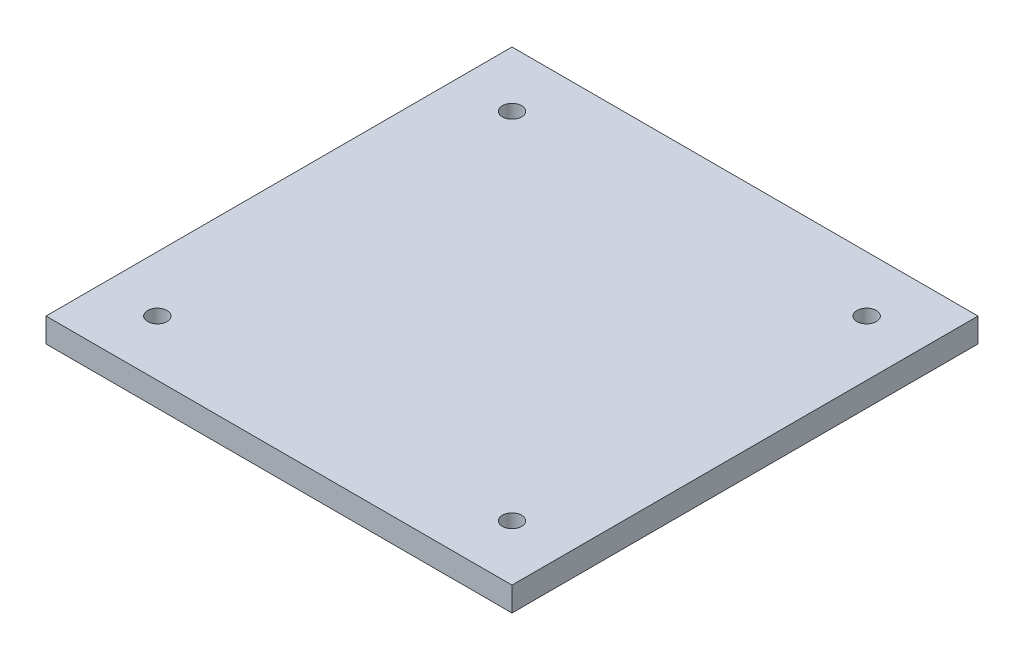
ISO-10303-21;
HEADER;
FILE_DESCRIPTION(('STEP AP214'),'2;1');
FILE_NAME('part.step','',(''),(''),'','','');
FILE_SCHEMA(('AUTOMOTIVE_DESIGN { 1 0 10303 214 1 1 1 1 }'));
ENDSEC;
DATA;
#1=APPLICATION_CONTEXT('core data for automotive mechanical design processes');
#2=APPLICATION_PROTOCOL_DEFINITION('international standard','automotive_design',2000,#1);
#3=PRODUCT_CONTEXT('',#1,'mechanical');
#4=PRODUCT('Part','Part','',(#3));
#5=PRODUCT_RELATED_PRODUCT_CATEGORY('part','',(#4));
#6=PRODUCT_DEFINITION_FORMATION('','',#4);
#7=PRODUCT_DEFINITION_CONTEXT('part definition',#1,'design');
#8=PRODUCT_DEFINITION('design','',#6,#7);
#9=PRODUCT_DEFINITION_SHAPE('','',#8);
#10=(LENGTH_UNIT() NAMED_UNIT(*) SI_UNIT(.MILLI.,.METRE.));
#11=(NAMED_UNIT(*) PLANE_ANGLE_UNIT() SI_UNIT($,.RADIAN.));
#12=(NAMED_UNIT(*) SI_UNIT($,.STERADIAN.) SOLID_ANGLE_UNIT());
#13=UNCERTAINTY_MEASURE_WITH_UNIT(LENGTH_MEASURE(1.E-05),#10,'distance_accuracy_value','');
#14=(GEOMETRIC_REPRESENTATION_CONTEXT(3) GLOBAL_UNCERTAINTY_ASSIGNED_CONTEXT((#13)) GLOBAL_UNIT_ASSIGNED_CONTEXT((#10,
#11,#12)) REPRESENTATION_CONTEXT('',''));
#15=CARTESIAN_POINT('',(0.,0.,0.));
#16=DIRECTION('',(0.,0.,1.));
#17=DIRECTION('',(1.,0.,0.));
#18=AXIS2_PLACEMENT_3D('',#15,#16,#17);
#19=CARTESIAN_POINT('',(-19.5844754492533,2.,-13.0472222222222));
#20=DIRECTION('',(1.,0.,0.));
#21=DIRECTION('',(0.,0.,-1.));
#22=AXIS2_PLACEMENT_3D('',#19,#20,#21);
#23=PLANE('',#22);
#24=DIRECTION('',(0.,0.,1.));
#25=VECTOR('',#24,1.);
#26=CARTESIAN_POINT('',(-19.5844754492533,0.,-13.0472222222222));
#27=LINE('',#26,#25);
#28=CARTESIAN_POINT('',(-19.5844754492533,0.,-13.0472222222222));
#29=VERTEX_POINT('',#28);
#30=CARTESIAN_POINT('',(-19.5844754492533,0.,25.4527777777778));
#31=VERTEX_POINT('',#30);
#32=EDGE_CURVE('E98',#29,#31,#27,.T.);
#33=ORIENTED_EDGE('',*,*,#32,.T.);
#34=DIRECTION('',(0.,-1.,0.));
#35=VECTOR('',#34,1.);
#36=CARTESIAN_POINT('',(-19.5844754492533,2.,25.4527777777778));
#37=LINE('',#36,#35);
#38=CARTESIAN_POINT('',(-19.5844754492533,2.,25.4527777777778));
#39=VERTEX_POINT('',#38);
#40=EDGE_CURVE('E11',#39,#31,#37,.T.);
#41=ORIENTED_EDGE('',*,*,#40,.F.);
#42=DIRECTION('',(0.,0.,1.));
#43=VECTOR('',#42,1.);
#44=CARTESIAN_POINT('',(-19.5844754492533,2.,-13.0472222222222));
#45=LINE('',#44,#43);
#46=CARTESIAN_POINT('',(-19.5844754492533,2.,-13.0472222222222));
#47=VERTEX_POINT('',#46);
#48=EDGE_CURVE('E86',#47,#39,#45,.T.);
#49=ORIENTED_EDGE('',*,*,#48,.F.);
#50=DIRECTION('',(0.,-1.,0.));
#51=VECTOR('',#50,1.);
#52=CARTESIAN_POINT('',(-19.5844754492533,2.,-13.0472222222222));
#53=LINE('',#52,#51);
#54=EDGE_CURVE('E94',#47,#29,#53,.T.);
#55=ORIENTED_EDGE('',*,*,#54,.T.);
#56=EDGE_LOOP('',(#33,#41,#49,#55));
#57=FACE_BOUND('',#56,.T.);
#58=ADVANCED_FACE('F35',(#57),#23,.F.);
#59=CARTESIAN_POINT('',(-19.5844754492533,2.,25.4527777777778));
#60=DIRECTION('',(0.,0.,-1.));
#61=DIRECTION('',(-1.,0.,0.));
#62=AXIS2_PLACEMENT_3D('',#59,#60,#61);
#63=PLANE('',#62);
#64=DIRECTION('',(1.,0.,0.));
#65=VECTOR('',#64,1.);
#66=CARTESIAN_POINT('',(-19.5844754492533,0.,25.4527777777778));
#67=LINE('',#66,#65);
#68=CARTESIAN_POINT('',(18.9155245507467,0.,25.4527777777778));
#69=VERTEX_POINT('',#68);
#70=EDGE_CURVE('E90',#31,#69,#67,.T.);
#71=ORIENTED_EDGE('',*,*,#70,.T.);
#72=DIRECTION('',(0.,-1.,0.));
#73=VECTOR('',#72,1.);
#74=CARTESIAN_POINT('',(18.9155245507467,2.,25.4527777777778));
#75=LINE('',#74,#73);
#76=CARTESIAN_POINT('',(18.9155245507467,2.,25.4527777777778));
#77=VERTEX_POINT('',#76);
#78=EDGE_CURVE('E43',#77,#69,#75,.T.);
#79=ORIENTED_EDGE('',*,*,#78,.F.);
#80=DIRECTION('',(1.,0.,0.));
#81=VECTOR('',#80,1.);
#82=CARTESIAN_POINT('',(-19.5844754492533,2.,25.4527777777778));
#83=LINE('',#82,#81);
#84=EDGE_CURVE('E81',#39,#77,#83,.T.);
#85=ORIENTED_EDGE('',*,*,#84,.F.);
#86=ORIENTED_EDGE('',*,*,#40,.T.);
#87=EDGE_LOOP('',(#71,#79,#85,#86));
#88=FACE_BOUND('',#87,.T.);
#89=ADVANCED_FACE('F89',(#88),#63,.F.);
#90=CARTESIAN_POINT('',(18.9155245507467,2.,-13.0472222222222));
#91=DIRECTION('',(-1.,0.,0.));
#92=DIRECTION('',(0.,0.,1.));
#93=AXIS2_PLACEMENT_3D('',#90,#91,#92);
#94=PLANE('',#93);
#95=DIRECTION('',(0.,0.,-1.));
#96=VECTOR('',#95,1.);
#97=CARTESIAN_POINT('',(18.9155245507467,0.,-13.0472222222222));
#98=LINE('',#97,#96);
#99=CARTESIAN_POINT('',(18.9155245507467,0.,-13.0472222222222));
#100=VERTEX_POINT('',#99);
#101=EDGE_CURVE('E68',#69,#100,#98,.T.);
#102=ORIENTED_EDGE('',*,*,#101,.T.);
#103=DIRECTION('',(0.,-1.,0.));
#104=VECTOR('',#103,1.);
#105=CARTESIAN_POINT('',(18.9155245507467,2.,-13.0472222222222));
#106=LINE('',#105,#104);
#107=CARTESIAN_POINT('',(18.9155245507467,2.,-13.0472222222222));
#108=VERTEX_POINT('',#107);
#109=EDGE_CURVE('E91',#108,#100,#106,.T.);
#110=ORIENTED_EDGE('',*,*,#109,.F.);
#111=DIRECTION('',(0.,0.,-1.));
#112=VECTOR('',#111,1.);
#113=CARTESIAN_POINT('',(18.9155245507467,2.,-13.0472222222222));
#114=LINE('',#113,#112);
#115=EDGE_CURVE('E84',#77,#108,#114,.T.);
#116=ORIENTED_EDGE('',*,*,#115,.F.);
#117=ORIENTED_EDGE('',*,*,#78,.T.);
#118=EDGE_LOOP('',(#102,#110,#116,#117));
#119=FACE_BOUND('',#118,.T.);
#120=ADVANCED_FACE('F92',(#119),#94,.F.);
#121=CARTESIAN_POINT('',(-19.5844754492533,2.,-13.0472222222222));
#122=DIRECTION('',(0.,0.,1.));
#123=DIRECTION('',(1.,0.,0.));
#124=AXIS2_PLACEMENT_3D('',#121,#122,#123);
#125=PLANE('',#124);
#126=DIRECTION('',(-1.,0.,0.));
#127=VECTOR('',#126,1.);
#128=CARTESIAN_POINT('',(-19.5844754492533,0.,-13.0472222222222));
#129=LINE('',#128,#127);
#130=EDGE_CURVE('E74',#100,#29,#129,.T.);
#131=ORIENTED_EDGE('',*,*,#130,.T.);
#132=ORIENTED_EDGE('',*,*,#54,.F.);
#133=DIRECTION('',(-1.,0.,0.));
#134=VECTOR('',#133,1.);
#135=CARTESIAN_POINT('',(-19.5844754492533,2.,-13.0472222222222));
#136=LINE('',#135,#134);
#137=EDGE_CURVE('E51',#108,#47,#136,.T.);
#138=ORIENTED_EDGE('',*,*,#137,.F.);
#139=ORIENTED_EDGE('',*,*,#109,.T.);
#140=EDGE_LOOP('',(#131,#132,#138,#139));
#141=FACE_BOUND('',#140,.T.);
#142=ADVANCED_FACE('F106',(#141),#125,.F.);
#143=CARTESIAN_POINT('',(0.,2.,0.));
#144=DIRECTION('',(0.,1.,0.));
#145=DIRECTION('',(0.,0.,1.));
#146=AXIS2_PLACEMENT_3D('',#143,#144,#145);
#147=PLANE('',#146);
#148=CARTESIAN_POINT('',(-14.9844754492533,2.,-8.44722222222222));
#149=DIRECTION('',(0.,1.,0.));
#150=DIRECTION('',(0.,0.,1.));
#151=AXIS2_PLACEMENT_3D('',#148,#149,#150);
#152=CIRCLE('',#151,0.799999999999988);
#153=CARTESIAN_POINT('',(-14.9844754492533,2.,-7.64722222222223));
#154=VERTEX_POINT('',#153);
#155=EDGE_CURVE('E132',#154,#154,#152,.T.);
#156=ORIENTED_EDGE('',*,*,#155,.F.);
#157=EDGE_LOOP('',(#156));
#158=FACE_BOUND('',#157,.T.);
#159=CARTESIAN_POINT('',(14.3155245507467,2.,20.8527777777778));
#160=DIRECTION('',(0.,1.,0.));
#161=DIRECTION('',(0.,0.,1.));
#162=AXIS2_PLACEMENT_3D('',#159,#160,#161);
#163=CIRCLE('',#162,0.799999999999988);
#164=CARTESIAN_POINT('',(14.3155245507467,2.,21.6527777777778));
#165=VERTEX_POINT('',#164);
#166=EDGE_CURVE('E126',#165,#165,#163,.T.);
#167=ORIENTED_EDGE('',*,*,#166,.F.);
#168=EDGE_LOOP('',(#167));
#169=FACE_BOUND('',#168,.T.);
#170=CARTESIAN_POINT('',(14.3155245507467,2.,-8.44722222222222));
#171=DIRECTION('',(0.,1.,0.));
#172=DIRECTION('',(0.,0.,1.));
#173=AXIS2_PLACEMENT_3D('',#170,#171,#172);
#174=CIRCLE('',#173,0.799999999999988);
#175=CARTESIAN_POINT('',(14.3155245507467,2.,-7.64722222222223));
#176=VERTEX_POINT('',#175);
#177=EDGE_CURVE('E120',#176,#176,#174,.T.);
#178=ORIENTED_EDGE('',*,*,#177,.F.);
#179=EDGE_LOOP('',(#178));
#180=FACE_BOUND('',#179,.T.);
#181=CARTESIAN_POINT('',(-14.9844754492533,2.,20.8527777777778));
#182=DIRECTION('',(0.,1.,0.));
#183=DIRECTION('',(0.,0.,1.));
#184=AXIS2_PLACEMENT_3D('',#181,#182,#183);
#185=CIRCLE('',#184,0.799999999999988);
#186=CARTESIAN_POINT('',(-14.9844754492533,2.,21.6527777777778));
#187=VERTEX_POINT('',#186);
#188=EDGE_CURVE('E114',#187,#187,#185,.T.);
#189=ORIENTED_EDGE('',*,*,#188,.F.);
#190=EDGE_LOOP('',(#189));
#191=FACE_BOUND('',#190,.T.);
#192=ORIENTED_EDGE('',*,*,#48,.T.);
#193=ORIENTED_EDGE('',*,*,#84,.T.);
#194=ORIENTED_EDGE('',*,*,#115,.T.);
#195=ORIENTED_EDGE('',*,*,#137,.T.);
#196=EDGE_LOOP('',(#192,#193,#194,#195));
#197=FACE_BOUND('',#196,.T.);
#198=ADVANCED_FACE('F82',(#158,#169,#180,#191,#197),#147,.T.);
#199=CARTESIAN_POINT('',(0.,0.,0.));
#200=DIRECTION('',(0.,1.,0.));
#201=DIRECTION('',(0.,0.,1.));
#202=AXIS2_PLACEMENT_3D('',#199,#200,#201);
#203=PLANE('',#202);
#204=CARTESIAN_POINT('',(-14.9844754492533,0.,-8.44722222222222));
#205=DIRECTION('',(0.,1.,0.));
#206=DIRECTION('',(0.,0.,1.));
#207=AXIS2_PLACEMENT_3D('',#204,#205,#206);
#208=CIRCLE('',#207,0.799999999999993);
#209=CARTESIAN_POINT('',(-14.9844754492533,0.,-7.64722222222223));
#210=VERTEX_POINT('',#209);
#211=EDGE_CURVE('E129',#210,#210,#208,.T.);
#212=ORIENTED_EDGE('',*,*,#211,.T.);
#213=EDGE_LOOP('',(#212));
#214=FACE_BOUND('',#213,.T.);
#215=CARTESIAN_POINT('',(14.3155245507467,0.,20.8527777777778));
#216=DIRECTION('',(0.,1.,0.));
#217=DIRECTION('',(0.,0.,1.));
#218=AXIS2_PLACEMENT_3D('',#215,#216,#217);
#219=CIRCLE('',#218,0.799999999999993);
#220=CARTESIAN_POINT('',(14.3155245507467,0.,21.6527777777778));
#221=VERTEX_POINT('',#220);
#222=EDGE_CURVE('E123',#221,#221,#219,.T.);
#223=ORIENTED_EDGE('',*,*,#222,.T.);
#224=EDGE_LOOP('',(#223));
#225=FACE_BOUND('',#224,.T.);
#226=CARTESIAN_POINT('',(14.3155245507467,0.,-8.44722222222222));
#227=DIRECTION('',(0.,1.,0.));
#228=DIRECTION('',(0.,0.,1.));
#229=AXIS2_PLACEMENT_3D('',#226,#227,#228);
#230=CIRCLE('',#229,0.799999999999993);
#231=CARTESIAN_POINT('',(14.3155245507467,0.,-7.64722222222223));
#232=VERTEX_POINT('',#231);
#233=EDGE_CURVE('E117',#232,#232,#230,.T.);
#234=ORIENTED_EDGE('',*,*,#233,.T.);
#235=EDGE_LOOP('',(#234));
#236=FACE_BOUND('',#235,.T.);
#237=CARTESIAN_POINT('',(-14.9844754492533,0.,20.8527777777778));
#238=DIRECTION('',(0.,1.,0.));
#239=DIRECTION('',(0.,0.,1.));
#240=AXIS2_PLACEMENT_3D('',#237,#238,#239);
#241=CIRCLE('',#240,0.799999999999993);
#242=CARTESIAN_POINT('',(-14.9844754492533,0.,21.6527777777778));
#243=VERTEX_POINT('',#242);
#244=EDGE_CURVE('E101',#243,#243,#241,.T.);
#245=ORIENTED_EDGE('',*,*,#244,.T.);
#246=EDGE_LOOP('',(#245));
#247=FACE_BOUND('',#246,.T.);
#248=ORIENTED_EDGE('',*,*,#32,.F.);
#249=ORIENTED_EDGE('',*,*,#130,.F.);
#250=ORIENTED_EDGE('',*,*,#101,.F.);
#251=ORIENTED_EDGE('',*,*,#70,.F.);
#252=EDGE_LOOP('',(#248,#249,#250,#251));
#253=FACE_BOUND('',#252,.T.);
#254=ADVANCED_FACE('F109',(#214,#225,#236,#247,#253),#203,.F.);
#255=CARTESIAN_POINT('',(-14.9844754492533,2.,20.8527777777778));
#256=DIRECTION('',(0.,1.,0.));
#257=DIRECTION('',(0.,0.,1.));
#258=AXIS2_PLACEMENT_3D('',#255,#256,#257);
#259=CYLINDRICAL_SURFACE('',#258,0.799999999999993);
#260=ORIENTED_EDGE('',*,*,#244,.F.);
#261=EDGE_LOOP('',(#260));
#262=FACE_BOUND('',#261,.T.);
#263=ORIENTED_EDGE('',*,*,#188,.T.);
#264=EDGE_LOOP('',(#263));
#265=FACE_BOUND('',#264,.T.);
#266=ADVANCED_FACE('F147',(#262,#265),#259,.F.);
#267=CARTESIAN_POINT('',(14.3155245507467,2.,-8.44722222222222));
#268=DIRECTION('',(0.,1.,0.));
#269=DIRECTION('',(0.,0.,1.));
#270=AXIS2_PLACEMENT_3D('',#267,#268,#269);
#271=CYLINDRICAL_SURFACE('',#270,0.799999999999993);
#272=ORIENTED_EDGE('',*,*,#233,.F.);
#273=EDGE_LOOP('',(#272));
#274=FACE_BOUND('',#273,.T.);
#275=ORIENTED_EDGE('',*,*,#177,.T.);
#276=EDGE_LOOP('',(#275));
#277=FACE_BOUND('',#276,.T.);
#278=ADVANCED_FACE('F149',(#274,#277),#271,.F.);
#279=CARTESIAN_POINT('',(14.3155245507467,2.,20.8527777777778));
#280=DIRECTION('',(0.,1.,0.));
#281=DIRECTION('',(0.,0.,1.));
#282=AXIS2_PLACEMENT_3D('',#279,#280,#281);
#283=CYLINDRICAL_SURFACE('',#282,0.799999999999993);
#284=ORIENTED_EDGE('',*,*,#222,.F.);
#285=EDGE_LOOP('',(#284));
#286=FACE_BOUND('',#285,.T.);
#287=ORIENTED_EDGE('',*,*,#166,.T.);
#288=EDGE_LOOP('',(#287));
#289=FACE_BOUND('',#288,.T.);
#290=ADVANCED_FACE('F156',(#286,#289),#283,.F.);
#291=CARTESIAN_POINT('',(-14.9844754492533,2.,-8.44722222222222));
#292=DIRECTION('',(0.,1.,0.));
#293=DIRECTION('',(0.,0.,1.));
#294=AXIS2_PLACEMENT_3D('',#291,#292,#293);
#295=CYLINDRICAL_SURFACE('',#294,0.799999999999993);
#296=ORIENTED_EDGE('',*,*,#211,.F.);
#297=EDGE_LOOP('',(#296));
#298=FACE_BOUND('',#297,.T.);
#299=ORIENTED_EDGE('',*,*,#155,.T.);
#300=EDGE_LOOP('',(#299));
#301=FACE_BOUND('',#300,.T.);
#302=ADVANCED_FACE('F136',(#298,#301),#295,.F.);
#303=CLOSED_SHELL('',(#58,#89,#120,#142,#198,#254,#266,#278,#290,#302));
#304=MANIFOLD_SOLID_BREP('B2',#303);
#305=ADVANCED_BREP_SHAPE_REPRESENTATION('',(#18,#304),#14);
#306=SHAPE_DEFINITION_REPRESENTATION(#9,#305);
ENDSEC;
END-ISO-10303-21;
